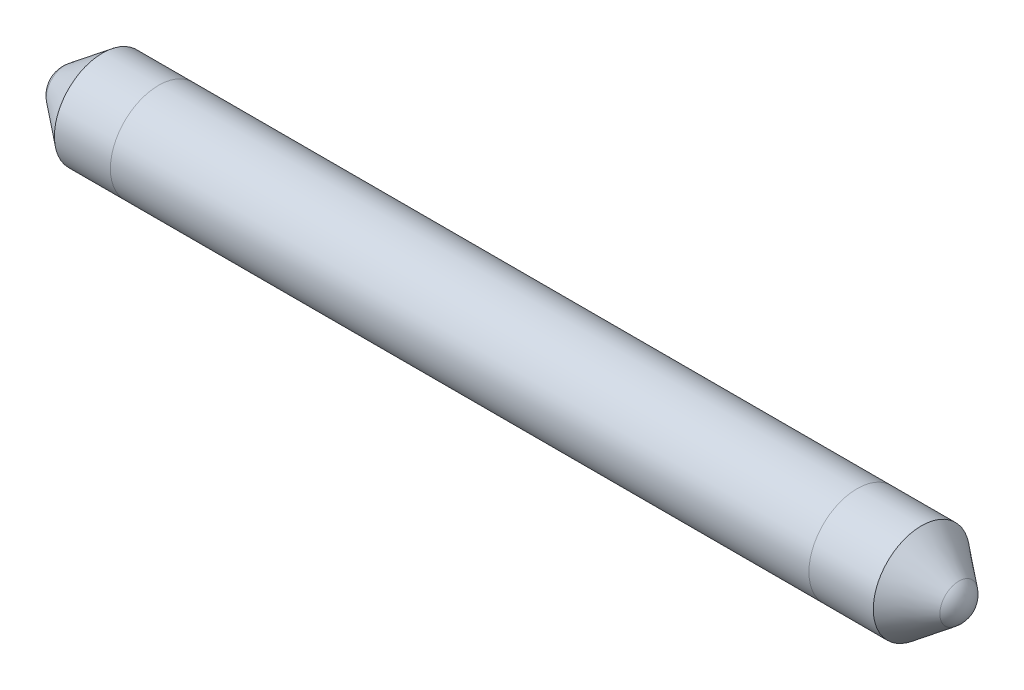
ISO-10303-21;
HEADER;
FILE_DESCRIPTION(('STEP AP214'),'2;1');
FILE_NAME('part.step','',(''),(''),'','','');
FILE_SCHEMA(('AUTOMOTIVE_DESIGN { 1 0 10303 214 1 1 1 1 }'));
ENDSEC;
DATA;
#1=APPLICATION_CONTEXT('core data for automotive mechanical design processes');
#2=APPLICATION_PROTOCOL_DEFINITION('international standard','automotive_design',2000,#1);
#3=PRODUCT_CONTEXT('',#1,'mechanical');
#4=PRODUCT('Part','Part','',(#3));
#5=PRODUCT_RELATED_PRODUCT_CATEGORY('part','',(#4));
#6=PRODUCT_DEFINITION_FORMATION('','',#4);
#7=PRODUCT_DEFINITION_CONTEXT('part definition',#1,'design');
#8=PRODUCT_DEFINITION('design','',#6,#7);
#9=PRODUCT_DEFINITION_SHAPE('','',#8);
#10=(LENGTH_UNIT() NAMED_UNIT(*) SI_UNIT(.MILLI.,.METRE.));
#11=(NAMED_UNIT(*) PLANE_ANGLE_UNIT() SI_UNIT($,.RADIAN.));
#12=(NAMED_UNIT(*) SI_UNIT($,.STERADIAN.) SOLID_ANGLE_UNIT());
#13=UNCERTAINTY_MEASURE_WITH_UNIT(LENGTH_MEASURE(1.E-05),#10,'distance_accuracy_value','');
#14=(GEOMETRIC_REPRESENTATION_CONTEXT(3) GLOBAL_UNCERTAINTY_ASSIGNED_CONTEXT((#13)) GLOBAL_UNIT_ASSIGNED_CONTEXT((#10,
#11,#12)) REPRESENTATION_CONTEXT('',''));
#15=CARTESIAN_POINT('',(0.,0.,0.));
#16=DIRECTION('',(0.,0.,1.));
#17=DIRECTION('',(1.,0.,0.));
#18=AXIS2_PLACEMENT_3D('',#15,#16,#17);
#19=CARTESIAN_POINT('',(0.,-101.643982592585,0.));
#20=DIRECTION('',(1.,0.,0.));
#21=DIRECTION('',(0.,1.,0.));
#22=AXIS2_PLACEMENT_3D('',#19,#20,#21);
#23=CYLINDRICAL_SURFACE('',#22,20.);
#24=CARTESIAN_POINT('',(-146.749372236452,-101.643982592585,0.));
#25=DIRECTION('',(-1.,0.,0.));
#26=DIRECTION('',(0.,0.,1.));
#27=AXIS2_PLACEMENT_3D('',#24,#25,#26);
#28=CIRCLE('',#27,20.);
#29=CARTESIAN_POINT('',(-146.749372236452,-101.643982592585,20.));
#30=VERTEX_POINT('',#29);
#31=EDGE_CURVE('E47',#30,#30,#28,.T.);
#32=ORIENTED_EDGE('',*,*,#31,.F.);
#33=EDGE_LOOP('',(#32));
#34=FACE_BOUND('',#33,.T.);
#35=CARTESIAN_POINT('',(143.284700236208,-101.643982592585,0.));
#36=DIRECTION('',(1.,0.,0.));
#37=DIRECTION('',(0.,0.,-1.));
#38=AXIS2_PLACEMENT_3D('',#35,#36,#37);
#39=CIRCLE('',#38,20.);
#40=CARTESIAN_POINT('',(143.284700236208,-101.643982592585,-20.));
#41=VERTEX_POINT('',#40);
#42=EDGE_CURVE('E10',#41,#41,#39,.T.);
#43=ORIENTED_EDGE('',*,*,#42,.F.);
#44=EDGE_LOOP('',(#43));
#45=FACE_BOUND('',#44,.T.);
#46=ADVANCED_FACE('F39',(#34,#45),#23,.T.);
#47=ORIENTED_EDGE('',*,*,#42,.T.);
#48=EDGE_LOOP('',(#47));
#49=FACE_BOUND('',#48,.T.);
#50=CARTESIAN_POINT('',(170.,-101.643982592585,0.));
#51=DIRECTION('',(1.,0.,0.));
#52=DIRECTION('',(0.,1.,0.));
#53=AXIS2_PLACEMENT_3D('',#50,#51,#52);
#54=CIRCLE('',#53,20.);
#55=CARTESIAN_POINT('',(170.,-81.6439825925851,0.));
#56=VERTEX_POINT('',#55);
#57=EDGE_CURVE('E68',#56,#56,#54,.T.);
#58=ORIENTED_EDGE('',*,*,#57,.F.);
#59=EDGE_LOOP('',(#58));
#60=FACE_BOUND('',#59,.T.);
#61=ADVANCED_FACE('F74',(#49,#60),#23,.T.);
#62=CARTESIAN_POINT('',(-179.372661972358,-101.643982592585,0.));
#63=DIRECTION('',(1.,0.,0.));
#64=DIRECTION('',(0.,-1.,0.));
#65=AXIS2_PLACEMENT_3D('',#62,#63,#64);
#66=SPHERICAL_SURFACE('',#65,9.99999999999999);
#67=CARTESIAN_POINT('',(-185.525206376971,-101.643982592585,0.));
#68=DIRECTION('',(1.,0.,0.));
#69=DIRECTION('',(0.,1.,0.));
#70=AXIS2_PLACEMENT_3D('',#67,#68,#69);
#71=CIRCLE('',#70,7.88328594871819);
#72=CARTESIAN_POINT('',(-185.525206376971,-93.7606966438669,0.));
#73=VERTEX_POINT('',#72);
#74=EDGE_CURVE('E54',#73,#73,#71,.T.);
#75=ORIENTED_EDGE('',*,*,#74,.F.);
#76=EDGE_LOOP('',(#75));
#77=FACE_BOUND('',#76,.T.);
#78=ADVANCED_FACE('F41',(#77),#66,.T.);
#79=CARTESIAN_POINT('',(-170.,-101.643982592585,0.));
#80=DIRECTION('',(1.,0.,0.));
#81=DIRECTION('',(0.,1.,0.));
#82=AXIS2_PLACEMENT_3D('',#79,#80,#81);
#83=CONICAL_SURFACE('',#82,20.,0.662708685262541);
#84=ORIENTED_EDGE('',*,*,#74,.T.);
#85=EDGE_LOOP('',(#84));
#86=FACE_BOUND('',#85,.T.);
#87=CARTESIAN_POINT('',(-170.,-101.643982592585,0.));
#88=DIRECTION('',(1.,0.,0.));
#89=DIRECTION('',(0.,1.,0.));
#90=AXIS2_PLACEMENT_3D('',#87,#88,#89);
#91=CIRCLE('',#90,20.);
#92=CARTESIAN_POINT('',(-170.,-81.6439825925851,0.));
#93=VERTEX_POINT('',#92);
#94=EDGE_CURVE('E60',#93,#93,#91,.T.);
#95=ORIENTED_EDGE('',*,*,#94,.F.);
#96=EDGE_LOOP('',(#95));
#97=FACE_BOUND('',#96,.T.);
#98=ADVANCED_FACE('F82',(#86,#97),#83,.T.);
#99=ORIENTED_EDGE('',*,*,#31,.T.);
#100=EDGE_LOOP('',(#99));
#101=FACE_BOUND('',#100,.T.);
#102=ORIENTED_EDGE('',*,*,#94,.T.);
#103=EDGE_LOOP('',(#102));
#104=FACE_BOUND('',#103,.T.);
#105=ADVANCED_FACE('F77',(#101,#104),#23,.T.);
#106=CARTESIAN_POINT('',(179.372661972358,-101.643982592585,0.));
#107=DIRECTION('',(-1.,0.,0.));
#108=DIRECTION('',(0.,-1.,0.));
#109=AXIS2_PLACEMENT_3D('',#106,#107,#108);
#110=SPHERICAL_SURFACE('',#109,9.99999999999999);
#111=CARTESIAN_POINT('',(185.525206376971,-101.643982592585,0.));
#112=DIRECTION('',(1.,0.,0.));
#113=DIRECTION('',(0.,1.,0.));
#114=AXIS2_PLACEMENT_3D('',#111,#112,#113);
#115=CIRCLE('',#114,7.88328594871819);
#116=CARTESIAN_POINT('',(185.525206376971,-93.7606966438669,0.));
#117=VERTEX_POINT('',#116);
#118=EDGE_CURVE('E65',#117,#117,#115,.T.);
#119=ORIENTED_EDGE('',*,*,#118,.T.);
#120=EDGE_LOOP('',(#119));
#121=FACE_BOUND('',#120,.T.);
#122=ADVANCED_FACE('F87',(#121),#110,.T.);
#123=CARTESIAN_POINT('',(170.,-101.643982592585,0.));
#124=DIRECTION('',(-1.,0.,0.));
#125=DIRECTION('',(0.,1.,0.));
#126=AXIS2_PLACEMENT_3D('',#123,#124,#125);
#127=CONICAL_SURFACE('',#126,20.,0.662708685262541);
#128=ORIENTED_EDGE('',*,*,#118,.F.);
#129=EDGE_LOOP('',(#128));
#130=FACE_BOUND('',#129,.T.);
#131=ORIENTED_EDGE('',*,*,#57,.T.);
#132=EDGE_LOOP('',(#131));
#133=FACE_BOUND('',#132,.T.);
#134=ADVANCED_FACE('F72',(#130,#133),#127,.T.);
#135=CLOSED_SHELL('',(#46,#61,#78,#98,#105,#122,#134));
#136=MANIFOLD_SOLID_BREP('B2',#135);
#137=ADVANCED_BREP_SHAPE_REPRESENTATION('',(#18,#136),#14);
#138=SHAPE_DEFINITION_REPRESENTATION(#9,#137);
ENDSEC;
END-ISO-10303-21;
